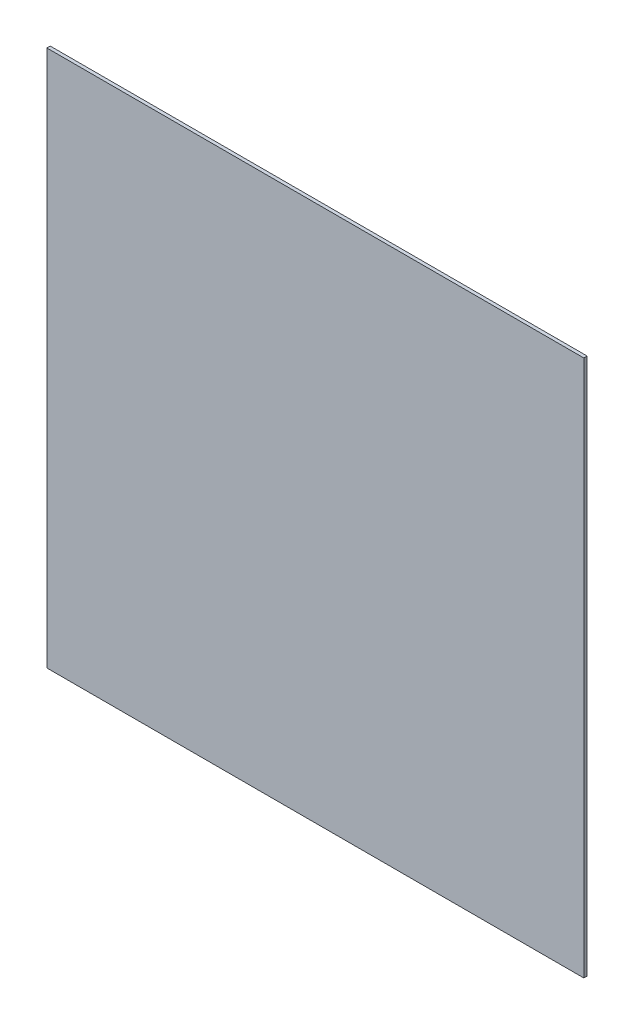
ISO-10303-21;
HEADER;
FILE_DESCRIPTION(('STEP AP214'),'2;1');
FILE_NAME('part.step','',(''),(''),'','','');
FILE_SCHEMA(('AUTOMOTIVE_DESIGN { 1 0 10303 214 1 1 1 1 }'));
ENDSEC;
DATA;
#1=APPLICATION_CONTEXT('core data for automotive mechanical design processes');
#2=APPLICATION_PROTOCOL_DEFINITION('international standard','automotive_design',2000,#1);
#3=PRODUCT_CONTEXT('',#1,'mechanical');
#4=PRODUCT('Part','Part','',(#3));
#5=PRODUCT_RELATED_PRODUCT_CATEGORY('part','',(#4));
#6=PRODUCT_DEFINITION_FORMATION('','',#4);
#7=PRODUCT_DEFINITION_CONTEXT('part definition',#1,'design');
#8=PRODUCT_DEFINITION('design','',#6,#7);
#9=PRODUCT_DEFINITION_SHAPE('','',#8);
#10=(LENGTH_UNIT() NAMED_UNIT(*) SI_UNIT(.MILLI.,.METRE.));
#11=(NAMED_UNIT(*) PLANE_ANGLE_UNIT() SI_UNIT($,.RADIAN.));
#12=(NAMED_UNIT(*) SI_UNIT($,.STERADIAN.) SOLID_ANGLE_UNIT());
#13=UNCERTAINTY_MEASURE_WITH_UNIT(LENGTH_MEASURE(1.E-05),#10,'distance_accuracy_value','');
#14=(GEOMETRIC_REPRESENTATION_CONTEXT(3) GLOBAL_UNCERTAINTY_ASSIGNED_CONTEXT((#13)) GLOBAL_UNIT_ASSIGNED_CONTEXT((#10,
#11,#12)) REPRESENTATION_CONTEXT('',''));
#15=CARTESIAN_POINT('',(0.,0.,0.));
#16=DIRECTION('',(0.,0.,1.));
#17=DIRECTION('',(1.,0.,0.));
#18=AXIS2_PLACEMENT_3D('',#15,#16,#17);
#19=CARTESIAN_POINT('',(0.80000094,0.80000094,0.00999998));
#20=DIRECTION('',(0.,0.,1.));
#21=DIRECTION('',(1.,0.,0.));
#22=AXIS2_PLACEMENT_3D('',#19,#20,#21);
#23=PLANE('',#22);
#24=DIRECTION('',(1.,0.,0.));
#25=VECTOR('',#24,1.);
#26=CARTESIAN_POINT('',(-0.80000094,0.80000094,0.00999998));
#27=LINE('',#26,#25);
#28=CARTESIAN_POINT('',(-0.80000094,0.80000094,0.00999998));
#29=VERTEX_POINT('',#28);
#30=CARTESIAN_POINT('',(0.80000094,0.80000094,0.00999998));
#31=VERTEX_POINT('',#30);
#32=EDGE_CURVE('E25',#29,#31,#27,.T.);
#33=ORIENTED_EDGE('',*,*,#32,.F.);
#34=DIRECTION('',(0.,1.,0.));
#35=VECTOR('',#34,1.);
#36=CARTESIAN_POINT('',(-0.80000094,-0.80000094,0.00999998));
#37=LINE('',#36,#35);
#38=CARTESIAN_POINT('',(-0.80000094,-0.80000094,0.00999998));
#39=VERTEX_POINT('',#38);
#40=EDGE_CURVE('E100',#39,#29,#37,.T.);
#41=ORIENTED_EDGE('',*,*,#40,.F.);
#42=DIRECTION('',(-1.,0.,0.));
#43=VECTOR('',#42,1.);
#44=CARTESIAN_POINT('',(0.80000094,-0.80000094,0.00999998));
#45=LINE('',#44,#43);
#46=CARTESIAN_POINT('',(0.80000094,-0.80000094,0.00999998));
#47=VERTEX_POINT('',#46);
#48=EDGE_CURVE('E83',#47,#39,#45,.T.);
#49=ORIENTED_EDGE('',*,*,#48,.F.);
#50=DIRECTION('',(0.,-1.,0.));
#51=VECTOR('',#50,1.);
#52=CARTESIAN_POINT('',(0.80000094,0.80000094,0.00999998));
#53=LINE('',#52,#51);
#54=EDGE_CURVE('E87',#31,#47,#53,.T.);
#55=ORIENTED_EDGE('',*,*,#54,.F.);
#56=EDGE_LOOP('',(#33,#41,#49,#55));
#57=FACE_BOUND('',#56,.T.);
#58=ADVANCED_FACE('F17',(#57),#23,.T.);
#59=CARTESIAN_POINT('',(0.80000094,0.80000094,0.));
#60=DIRECTION('',(0.,0.,1.));
#61=DIRECTION('',(1.,0.,0.));
#62=AXIS2_PLACEMENT_3D('',#59,#60,#61);
#63=PLANE('',#62);
#64=DIRECTION('',(0.,-1.,0.));
#65=VECTOR('',#64,1.);
#66=CARTESIAN_POINT('',(0.80000094,0.80000094,0.));
#67=LINE('',#66,#65);
#68=CARTESIAN_POINT('',(0.80000094,0.80000094,0.));
#69=VERTEX_POINT('',#68);
#70=CARTESIAN_POINT('',(0.80000094,-0.80000094,0.));
#71=VERTEX_POINT('',#70);
#72=EDGE_CURVE('E71',#69,#71,#67,.T.);
#73=ORIENTED_EDGE('',*,*,#72,.T.);
#74=DIRECTION('',(-1.,0.,0.));
#75=VECTOR('',#74,1.);
#76=CARTESIAN_POINT('',(0.80000094,-0.80000094,0.));
#77=LINE('',#76,#75);
#78=CARTESIAN_POINT('',(-0.80000094,-0.80000094,0.));
#79=VERTEX_POINT('',#78);
#80=EDGE_CURVE('E97',#71,#79,#77,.T.);
#81=ORIENTED_EDGE('',*,*,#80,.T.);
#82=DIRECTION('',(0.,1.,0.));
#83=VECTOR('',#82,1.);
#84=CARTESIAN_POINT('',(-0.80000094,-0.80000094,0.));
#85=LINE('',#84,#83);
#86=CARTESIAN_POINT('',(-0.80000094,0.80000094,0.));
#87=VERTEX_POINT('',#86);
#88=EDGE_CURVE('E73',#79,#87,#85,.T.);
#89=ORIENTED_EDGE('',*,*,#88,.T.);
#90=DIRECTION('',(1.,0.,0.));
#91=VECTOR('',#90,1.);
#92=CARTESIAN_POINT('',(-0.80000094,0.80000094,0.));
#93=LINE('',#92,#91);
#94=EDGE_CURVE('E11',#87,#69,#93,.T.);
#95=ORIENTED_EDGE('',*,*,#94,.T.);
#96=EDGE_LOOP('',(#73,#81,#89,#95));
#97=FACE_BOUND('',#96,.T.);
#98=ADVANCED_FACE('F69',(#97),#63,.F.);
#99=CARTESIAN_POINT('',(-0.80000094,0.80000094,0.));
#100=DIRECTION('',(0.,1.,0.));
#101=DIRECTION('',(1.,0.,0.));
#102=AXIS2_PLACEMENT_3D('',#99,#100,#101);
#103=PLANE('',#102);
#104=DIRECTION('',(0.,0.,1.));
#105=VECTOR('',#104,1.);
#106=CARTESIAN_POINT('',(-0.80000094,0.80000094,0.));
#107=LINE('',#106,#105);
#108=EDGE_CURVE('E107',#87,#29,#107,.T.);
#109=ORIENTED_EDGE('',*,*,#108,.T.);
#110=ORIENTED_EDGE('',*,*,#32,.T.);
#111=DIRECTION('',(0.,0.,1.));
#112=VECTOR('',#111,1.);
#113=CARTESIAN_POINT('',(0.80000094,0.80000094,0.));
#114=LINE('',#113,#112);
#115=EDGE_CURVE('E79',#69,#31,#114,.T.);
#116=ORIENTED_EDGE('',*,*,#115,.F.);
#117=ORIENTED_EDGE('',*,*,#94,.F.);
#118=EDGE_LOOP('',(#109,#110,#116,#117));
#119=FACE_BOUND('',#118,.T.);
#120=ADVANCED_FACE('F85',(#119),#103,.T.);
#121=CARTESIAN_POINT('',(-0.80000094,-0.80000094,0.));
#122=DIRECTION('',(-1.,0.,0.));
#123=DIRECTION('',(0.,0.,1.));
#124=AXIS2_PLACEMENT_3D('',#121,#122,#123);
#125=PLANE('',#124);
#126=DIRECTION('',(0.,0.,1.));
#127=VECTOR('',#126,1.);
#128=CARTESIAN_POINT('',(-0.80000094,-0.80000094,0.));
#129=LINE('',#128,#127);
#130=EDGE_CURVE('E101',#79,#39,#129,.T.);
#131=ORIENTED_EDGE('',*,*,#130,.T.);
#132=ORIENTED_EDGE('',*,*,#40,.T.);
#133=ORIENTED_EDGE('',*,*,#108,.F.);
#134=ORIENTED_EDGE('',*,*,#88,.F.);
#135=EDGE_LOOP('',(#131,#132,#133,#134));
#136=FACE_BOUND('',#135,.T.);
#137=ADVANCED_FACE('F141',(#136),#125,.T.);
#138=CARTESIAN_POINT('',(0.80000094,-0.80000094,0.));
#139=DIRECTION('',(0.,-1.,0.));
#140=DIRECTION('',(0.,0.,-1.));
#141=AXIS2_PLACEMENT_3D('',#138,#139,#140);
#142=PLANE('',#141);
#143=DIRECTION('',(0.,0.,1.));
#144=VECTOR('',#143,1.);
#145=CARTESIAN_POINT('',(0.80000094,-0.80000094,0.));
#146=LINE('',#145,#144);
#147=EDGE_CURVE('E81',#71,#47,#146,.T.);
#148=ORIENTED_EDGE('',*,*,#147,.T.);
#149=ORIENTED_EDGE('',*,*,#48,.T.);
#150=ORIENTED_EDGE('',*,*,#130,.F.);
#151=ORIENTED_EDGE('',*,*,#80,.F.);
#152=EDGE_LOOP('',(#148,#149,#150,#151));
#153=FACE_BOUND('',#152,.T.);
#154=ADVANCED_FACE('F131',(#153),#142,.T.);
#155=CARTESIAN_POINT('',(0.80000094,0.80000094,0.));
#156=DIRECTION('',(1.,0.,0.));
#157=DIRECTION('',(0.,1.,0.));
#158=AXIS2_PLACEMENT_3D('',#155,#156,#157);
#159=PLANE('',#158);
#160=ORIENTED_EDGE('',*,*,#115,.T.);
#161=ORIENTED_EDGE('',*,*,#54,.T.);
#162=ORIENTED_EDGE('',*,*,#147,.F.);
#163=ORIENTED_EDGE('',*,*,#72,.F.);
#164=EDGE_LOOP('',(#160,#161,#162,#163));
#165=FACE_BOUND('',#164,.T.);
#166=ADVANCED_FACE('F77',(#165),#159,.T.);
#167=CLOSED_SHELL('',(#58,#98,#120,#137,#154,#166));
#168=MANIFOLD_SOLID_BREP('B1',#167);
#169=ADVANCED_BREP_SHAPE_REPRESENTATION('',(#18,#168),#14);
#170=SHAPE_DEFINITION_REPRESENTATION(#9,#169);
ENDSEC;
END-ISO-10303-21;
